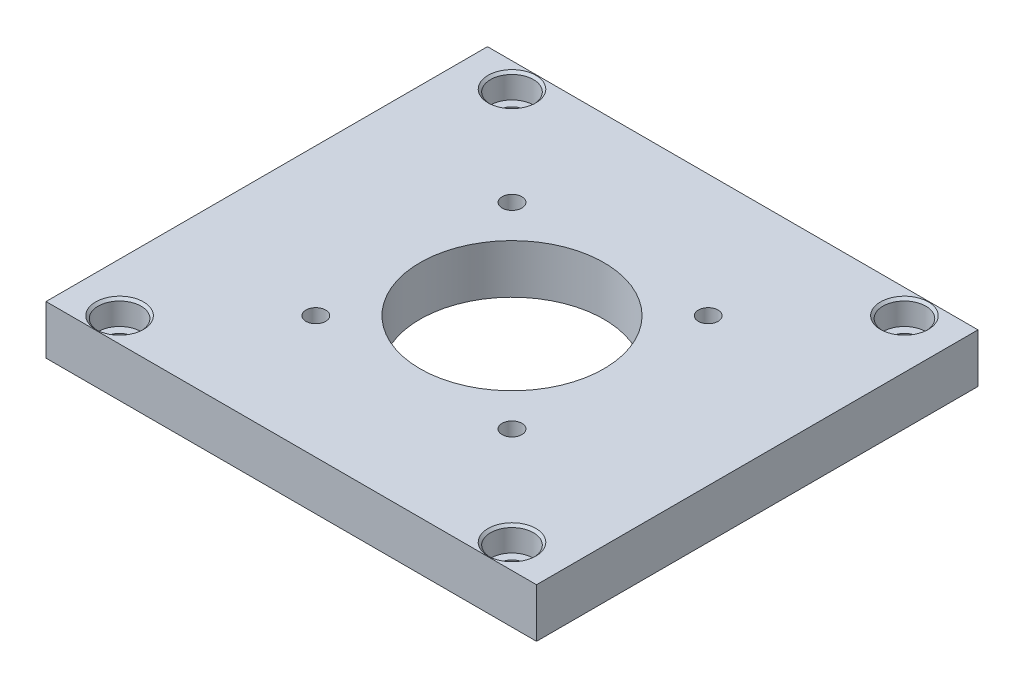
ISO-10303-21;
HEADER;
FILE_DESCRIPTION(('STEP AP214'),'2;1');
FILE_NAME('part.step','',(''),(''),'','','');
FILE_SCHEMA(('AUTOMOTIVE_DESIGN { 1 0 10303 214 1 1 1 1 }'));
ENDSEC;
DATA;
#1=APPLICATION_CONTEXT('core data for automotive mechanical design processes');
#2=APPLICATION_PROTOCOL_DEFINITION('international standard','automotive_design',2000,#1);
#3=PRODUCT_CONTEXT('',#1,'mechanical');
#4=PRODUCT('Part','Part','',(#3));
#5=PRODUCT_RELATED_PRODUCT_CATEGORY('part','',(#4));
#6=PRODUCT_DEFINITION_FORMATION('','',#4);
#7=PRODUCT_DEFINITION_CONTEXT('part definition',#1,'design');
#8=PRODUCT_DEFINITION('design','',#6,#7);
#9=PRODUCT_DEFINITION_SHAPE('','',#8);
#10=(LENGTH_UNIT() NAMED_UNIT(*) SI_UNIT(.MILLI.,.METRE.));
#11=(NAMED_UNIT(*) PLANE_ANGLE_UNIT() SI_UNIT($,.RADIAN.));
#12=(NAMED_UNIT(*) SI_UNIT($,.STERADIAN.) SOLID_ANGLE_UNIT());
#13=UNCERTAINTY_MEASURE_WITH_UNIT(LENGTH_MEASURE(1.E-05),#10,'distance_accuracy_value','');
#14=(GEOMETRIC_REPRESENTATION_CONTEXT(3) GLOBAL_UNCERTAINTY_ASSIGNED_CONTEXT((#13)) GLOBAL_UNIT_ASSIGNED_CONTEXT((#10,
#11,#12)) REPRESENTATION_CONTEXT('',''));
#15=CARTESIAN_POINT('',(0.,0.,0.));
#16=DIRECTION('',(0.,0.,1.));
#17=DIRECTION('',(1.,0.,0.));
#18=AXIS2_PLACEMENT_3D('',#15,#16,#17);
#19=CARTESIAN_POINT('',(-63.5,12.7,57.15));
#20=DIRECTION('',(1.,0.,0.));
#21=DIRECTION('',(0.,0.,-1.));
#22=AXIS2_PLACEMENT_3D('',#19,#20,#21);
#23=PLANE('',#22);
#24=DIRECTION('',(0.,0.,1.));
#25=VECTOR('',#24,1.);
#26=CARTESIAN_POINT('',(-63.5,0.,57.15));
#27=LINE('',#26,#25);
#28=CARTESIAN_POINT('',(-63.5,0.,-57.15));
#29=VERTEX_POINT('',#28);
#30=CARTESIAN_POINT('',(-63.5,0.,57.15));
#31=VERTEX_POINT('',#30);
#32=EDGE_CURVE('E106',#29,#31,#27,.T.);
#33=ORIENTED_EDGE('',*,*,#32,.T.);
#34=DIRECTION('',(0.,-1.,0.));
#35=VECTOR('',#34,1.);
#36=CARTESIAN_POINT('',(-63.5,12.7,57.15));
#37=LINE('',#36,#35);
#38=CARTESIAN_POINT('',(-63.5,12.7,57.15));
#39=VERTEX_POINT('',#38);
#40=EDGE_CURVE('E11',#39,#31,#37,.T.);
#41=ORIENTED_EDGE('',*,*,#40,.F.);
#42=DIRECTION('',(0.,0.,1.));
#43=VECTOR('',#42,1.);
#44=CARTESIAN_POINT('',(-63.5,12.7,57.15));
#45=LINE('',#44,#43);
#46=CARTESIAN_POINT('',(-63.5,12.7,-57.15));
#47=VERTEX_POINT('',#46);
#48=EDGE_CURVE('E93',#47,#39,#45,.T.);
#49=ORIENTED_EDGE('',*,*,#48,.F.);
#50=DIRECTION('',(0.,-1.,0.));
#51=VECTOR('',#50,1.);
#52=CARTESIAN_POINT('',(-63.5,12.7,-57.15));
#53=LINE('',#52,#51);
#54=EDGE_CURVE('E102',#47,#29,#53,.T.);
#55=ORIENTED_EDGE('',*,*,#54,.T.);
#56=EDGE_LOOP('',(#33,#41,#49,#55));
#57=FACE_BOUND('',#56,.T.);
#58=ADVANCED_FACE('F40',(#57),#23,.F.);
#59=CARTESIAN_POINT('',(63.5,12.7,57.15));
#60=DIRECTION('',(0.,0.,-1.));
#61=DIRECTION('',(-1.,0.,0.));
#62=AXIS2_PLACEMENT_3D('',#59,#60,#61);
#63=PLANE('',#62);
#64=DIRECTION('',(1.,0.,0.));
#65=VECTOR('',#64,1.);
#66=CARTESIAN_POINT('',(63.5,0.,57.15));
#67=LINE('',#66,#65);
#68=CARTESIAN_POINT('',(63.5,0.,57.15));
#69=VERTEX_POINT('',#68);
#70=EDGE_CURVE('E97',#31,#69,#67,.T.);
#71=ORIENTED_EDGE('',*,*,#70,.T.);
#72=DIRECTION('',(0.,-1.,0.));
#73=VECTOR('',#72,1.);
#74=CARTESIAN_POINT('',(63.5,12.7,57.15));
#75=LINE('',#74,#73);
#76=CARTESIAN_POINT('',(63.5,12.7,57.15));
#77=VERTEX_POINT('',#76);
#78=EDGE_CURVE('E49',#77,#69,#75,.T.);
#79=ORIENTED_EDGE('',*,*,#78,.F.);
#80=DIRECTION('',(1.,0.,0.));
#81=VECTOR('',#80,1.);
#82=CARTESIAN_POINT('',(63.5,12.7,57.15));
#83=LINE('',#82,#81);
#84=EDGE_CURVE('E88',#39,#77,#83,.T.);
#85=ORIENTED_EDGE('',*,*,#84,.F.);
#86=ORIENTED_EDGE('',*,*,#40,.T.);
#87=EDGE_LOOP('',(#71,#79,#85,#86));
#88=FACE_BOUND('',#87,.T.);
#89=ADVANCED_FACE('F96',(#88),#63,.F.);
#90=CARTESIAN_POINT('',(63.5,12.7,57.15));
#91=DIRECTION('',(-1.,0.,0.));
#92=DIRECTION('',(0.,0.,1.));
#93=AXIS2_PLACEMENT_3D('',#90,#91,#92);
#94=PLANE('',#93);
#95=DIRECTION('',(0.,0.,-1.));
#96=VECTOR('',#95,1.);
#97=CARTESIAN_POINT('',(63.5,0.,57.15));
#98=LINE('',#97,#96);
#99=CARTESIAN_POINT('',(63.5,0.,-57.15));
#100=VERTEX_POINT('',#99);
#101=EDGE_CURVE('E75',#69,#100,#98,.T.);
#102=ORIENTED_EDGE('',*,*,#101,.T.);
#103=DIRECTION('',(0.,-1.,0.));
#104=VECTOR('',#103,1.);
#105=CARTESIAN_POINT('',(63.5,12.7,-57.15));
#106=LINE('',#105,#104);
#107=CARTESIAN_POINT('',(63.5,12.7,-57.15));
#108=VERTEX_POINT('',#107);
#109=EDGE_CURVE('E98',#108,#100,#106,.T.);
#110=ORIENTED_EDGE('',*,*,#109,.F.);
#111=DIRECTION('',(0.,0.,-1.));
#112=VECTOR('',#111,1.);
#113=CARTESIAN_POINT('',(63.5,12.7,57.15));
#114=LINE('',#113,#112);
#115=EDGE_CURVE('E91',#77,#108,#114,.T.);
#116=ORIENTED_EDGE('',*,*,#115,.F.);
#117=ORIENTED_EDGE('',*,*,#78,.T.);
#118=EDGE_LOOP('',(#102,#110,#116,#117));
#119=FACE_BOUND('',#118,.T.);
#120=ADVANCED_FACE('F100',(#119),#94,.F.);
#121=CARTESIAN_POINT('',(63.5,12.7,-57.15));
#122=DIRECTION('',(0.,0.,1.));
#123=DIRECTION('',(1.,0.,0.));
#124=AXIS2_PLACEMENT_3D('',#121,#122,#123);
#125=PLANE('',#124);
#126=DIRECTION('',(-1.,0.,0.));
#127=VECTOR('',#126,1.);
#128=CARTESIAN_POINT('',(63.5,0.,-57.15));
#129=LINE('',#128,#127);
#130=EDGE_CURVE('E81',#100,#29,#129,.T.);
#131=ORIENTED_EDGE('',*,*,#130,.T.);
#132=ORIENTED_EDGE('',*,*,#54,.F.);
#133=DIRECTION('',(-1.,0.,0.));
#134=VECTOR('',#133,1.);
#135=CARTESIAN_POINT('',(63.5,12.7,-57.15));
#136=LINE('',#135,#134);
#137=EDGE_CURVE('E58',#108,#47,#136,.T.);
#138=ORIENTED_EDGE('',*,*,#137,.F.);
#139=ORIENTED_EDGE('',*,*,#109,.T.);
#140=EDGE_LOOP('',(#131,#132,#138,#139));
#141=FACE_BOUND('',#140,.T.);
#142=ADVANCED_FACE('F214',(#141),#125,.F.);
#143=CARTESIAN_POINT('',(0.,12.7,0.));
#144=DIRECTION('',(0.,1.,0.));
#145=DIRECTION('',(0.,0.,1.));
#146=AXIS2_PLACEMENT_3D('',#143,#144,#145);
#147=PLANE('',#146);
#148=CARTESIAN_POINT('',(-25.4,12.7,-25.4));
#149=DIRECTION('',(0.,1.,0.));
#150=DIRECTION('',(0.,0.,1.));
#151=AXIS2_PLACEMENT_3D('',#148,#149,#150);
#152=CIRCLE('',#151,2.55269999999999);
#153=CARTESIAN_POINT('',(-25.4,12.7,-22.8473));
#154=VERTEX_POINT('',#153);
#155=EDGE_CURVE('E139',#154,#154,#152,.T.);
#156=ORIENTED_EDGE('',*,*,#155,.F.);
#157=EDGE_LOOP('',(#156));
#158=FACE_BOUND('',#157,.T.);
#159=CARTESIAN_POINT('',(25.4,12.7,-25.4));
#160=DIRECTION('',(0.,1.,0.));
#161=DIRECTION('',(0.,0.,1.));
#162=AXIS2_PLACEMENT_3D('',#159,#160,#161);
#163=CIRCLE('',#162,2.55269999999999);
#164=CARTESIAN_POINT('',(25.4,12.7,-22.8473));
#165=VERTEX_POINT('',#164);
#166=EDGE_CURVE('E128',#165,#165,#163,.T.);
#167=ORIENTED_EDGE('',*,*,#166,.F.);
#168=EDGE_LOOP('',(#167));
#169=FACE_BOUND('',#168,.T.);
#170=CARTESIAN_POINT('',(25.4,12.7,25.4));
#171=DIRECTION('',(0.,1.,0.));
#172=DIRECTION('',(0.,0.,1.));
#173=AXIS2_PLACEMENT_3D('',#170,#171,#172);
#174=CIRCLE('',#173,2.55269999999999);
#175=CARTESIAN_POINT('',(25.4,12.7,27.9527));
#176=VERTEX_POINT('',#175);
#177=EDGE_CURVE('E124',#176,#176,#174,.T.);
#178=ORIENTED_EDGE('',*,*,#177,.F.);
#179=EDGE_LOOP('',(#178));
#180=FACE_BOUND('',#179,.T.);
#181=CARTESIAN_POINT('',(-25.4,12.7,25.4));
#182=DIRECTION('',(0.,1.,0.));
#183=DIRECTION('',(0.,0.,1.));
#184=AXIS2_PLACEMENT_3D('',#181,#182,#183);
#185=CIRCLE('',#184,2.55269999999999);
#186=CARTESIAN_POINT('',(-25.4,12.7,27.9527));
#187=VERTEX_POINT('',#186);
#188=EDGE_CURVE('E120',#187,#187,#185,.T.);
#189=ORIENTED_EDGE('',*,*,#188,.F.);
#190=EDGE_LOOP('',(#189));
#191=FACE_BOUND('',#190,.T.);
#192=CARTESIAN_POINT('',(-50.8,12.7,-50.8));
#193=DIRECTION('',(0.,1.,0.));
#194=DIRECTION('',(0.,0.,1.));
#195=AXIS2_PLACEMENT_3D('',#192,#193,#194);
#196=CIRCLE('',#195,6.19125);
#197=CARTESIAN_POINT('',(-50.8,12.7,-44.60875));
#198=VERTEX_POINT('',#197);
#199=EDGE_CURVE('E119',#198,#198,#196,.T.);
#200=ORIENTED_EDGE('',*,*,#199,.F.);
#201=EDGE_LOOP('',(#200));
#202=FACE_BOUND('',#201,.T.);
#203=CARTESIAN_POINT('',(50.8,12.7,-50.8));
#204=DIRECTION('',(0.,1.,0.));
#205=DIRECTION('',(0.,0.,1.));
#206=AXIS2_PLACEMENT_3D('',#203,#204,#205);
#207=CIRCLE('',#206,6.19125);
#208=CARTESIAN_POINT('',(50.8,12.7,-44.60875));
#209=VERTEX_POINT('',#208);
#210=EDGE_CURVE('E158',#209,#209,#207,.T.);
#211=ORIENTED_EDGE('',*,*,#210,.F.);
#212=EDGE_LOOP('',(#211));
#213=FACE_BOUND('',#212,.T.);
#214=CARTESIAN_POINT('',(50.8,12.7,50.8));
#215=DIRECTION('',(0.,1.,0.));
#216=DIRECTION('',(0.,0.,1.));
#217=AXIS2_PLACEMENT_3D('',#214,#215,#216);
#218=CIRCLE('',#217,6.19125);
#219=CARTESIAN_POINT('',(50.8,12.7,56.99125));
#220=VERTEX_POINT('',#219);
#221=EDGE_CURVE('E173',#220,#220,#218,.T.);
#222=ORIENTED_EDGE('',*,*,#221,.F.);
#223=EDGE_LOOP('',(#222));
#224=FACE_BOUND('',#223,.T.);
#225=CARTESIAN_POINT('',(-50.8,12.7,50.8));
#226=DIRECTION('',(0.,1.,0.));
#227=DIRECTION('',(0.,0.,1.));
#228=AXIS2_PLACEMENT_3D('',#225,#226,#227);
#229=CIRCLE('',#228,6.19125);
#230=CARTESIAN_POINT('',(-50.8,12.7,56.99125));
#231=VERTEX_POINT('',#230);
#232=EDGE_CURVE('E188',#231,#231,#229,.T.);
#233=ORIENTED_EDGE('',*,*,#232,.F.);
#234=EDGE_LOOP('',(#233));
#235=FACE_BOUND('',#234,.T.);
#236=CARTESIAN_POINT('',(0.,12.7,0.));
#237=DIRECTION('',(0.,1.,0.));
#238=DIRECTION('',(0.,0.,1.));
#239=AXIS2_PLACEMENT_3D('',#236,#237,#238);
#240=CIRCLE('',#239,23.8125);
#241=CARTESIAN_POINT('',(0.,12.7,23.8125));
#242=VERTEX_POINT('',#241);
#243=EDGE_CURVE('E203',#242,#242,#240,.T.);
#244=ORIENTED_EDGE('',*,*,#243,.F.);
#245=EDGE_LOOP('',(#244));
#246=FACE_BOUND('',#245,.T.);
#247=ORIENTED_EDGE('',*,*,#48,.T.);
#248=ORIENTED_EDGE('',*,*,#84,.T.);
#249=ORIENTED_EDGE('',*,*,#115,.T.);
#250=ORIENTED_EDGE('',*,*,#137,.T.);
#251=EDGE_LOOP('',(#247,#248,#249,#250));
#252=FACE_BOUND('',#251,.T.);
#253=ADVANCED_FACE('F89',(#158,#169,#180,#191,#202,#213,#224,#235,#246,#252),#147,.T.);
#254=CARTESIAN_POINT('',(0.,0.,0.));
#255=DIRECTION('',(0.,1.,0.));
#256=DIRECTION('',(0.,0.,1.));
#257=AXIS2_PLACEMENT_3D('',#254,#255,#256);
#258=PLANE('',#257);
#259=CARTESIAN_POINT('',(-25.4,0.,-25.4));
#260=DIRECTION('',(0.,1.,0.));
#261=DIRECTION('',(0.,0.,1.));
#262=AXIS2_PLACEMENT_3D('',#259,#260,#261);
#263=CIRCLE('',#262,2.55269999999999);
#264=CARTESIAN_POINT('',(-25.4,0.,-22.8473));
#265=VERTEX_POINT('',#264);
#266=EDGE_CURVE('E43',#265,#265,#263,.T.);
#267=ORIENTED_EDGE('',*,*,#266,.T.);
#268=EDGE_LOOP('',(#267));
#269=FACE_BOUND('',#268,.T.);
#270=CARTESIAN_POINT('',(25.4,0.,-25.4));
#271=DIRECTION('',(0.,1.,0.));
#272=DIRECTION('',(0.,0.,1.));
#273=AXIS2_PLACEMENT_3D('',#270,#271,#272);
#274=CIRCLE('',#273,2.55269999999999);
#275=CARTESIAN_POINT('',(25.4,0.,-22.8473));
#276=VERTEX_POINT('',#275);
#277=EDGE_CURVE('E125',#276,#276,#274,.T.);
#278=ORIENTED_EDGE('',*,*,#277,.T.);
#279=EDGE_LOOP('',(#278));
#280=FACE_BOUND('',#279,.T.);
#281=CARTESIAN_POINT('',(25.4,0.,25.4));
#282=DIRECTION('',(0.,1.,0.));
#283=DIRECTION('',(0.,0.,1.));
#284=AXIS2_PLACEMENT_3D('',#281,#282,#283);
#285=CIRCLE('',#284,2.55269999999999);
#286=CARTESIAN_POINT('',(25.4,0.,27.9527));
#287=VERTEX_POINT('',#286);
#288=EDGE_CURVE('E121',#287,#287,#285,.T.);
#289=ORIENTED_EDGE('',*,*,#288,.T.);
#290=EDGE_LOOP('',(#289));
#291=FACE_BOUND('',#290,.T.);
#292=CARTESIAN_POINT('',(-25.4,0.,25.4));
#293=DIRECTION('',(0.,1.,0.));
#294=DIRECTION('',(0.,0.,1.));
#295=AXIS2_PLACEMENT_3D('',#292,#293,#294);
#296=CIRCLE('',#295,2.55269999999999);
#297=CARTESIAN_POINT('',(-25.4,0.,27.9527));
#298=VERTEX_POINT('',#297);
#299=EDGE_CURVE('E115',#298,#298,#296,.T.);
#300=ORIENTED_EDGE('',*,*,#299,.T.);
#301=EDGE_LOOP('',(#300));
#302=FACE_BOUND('',#301,.T.);
#303=CARTESIAN_POINT('',(-50.8,0.,-50.8));
#304=DIRECTION('',(0.,1.,0.));
#305=DIRECTION('',(0.,0.,1.));
#306=AXIS2_PLACEMENT_3D('',#303,#304,#305);
#307=CIRCLE('',#306,3.37820000000001);
#308=CARTESIAN_POINT('',(-50.8,0.,-47.4218));
#309=VERTEX_POINT('',#308);
#310=EDGE_CURVE('E155',#309,#309,#307,.T.);
#311=ORIENTED_EDGE('',*,*,#310,.T.);
#312=EDGE_LOOP('',(#311));
#313=FACE_BOUND('',#312,.T.);
#314=CARTESIAN_POINT('',(50.8,0.,-50.8));
#315=DIRECTION('',(0.,1.,0.));
#316=DIRECTION('',(0.,0.,1.));
#317=AXIS2_PLACEMENT_3D('',#314,#315,#316);
#318=CIRCLE('',#317,3.37820000000001);
#319=CARTESIAN_POINT('',(50.8,0.,-47.4218));
#320=VERTEX_POINT('',#319);
#321=EDGE_CURVE('E170',#320,#320,#318,.T.);
#322=ORIENTED_EDGE('',*,*,#321,.T.);
#323=EDGE_LOOP('',(#322));
#324=FACE_BOUND('',#323,.T.);
#325=CARTESIAN_POINT('',(50.8,0.,50.8));
#326=DIRECTION('',(0.,1.,0.));
#327=DIRECTION('',(0.,0.,1.));
#328=AXIS2_PLACEMENT_3D('',#325,#326,#327);
#329=CIRCLE('',#328,3.37820000000001);
#330=CARTESIAN_POINT('',(50.8,0.,54.1782));
#331=VERTEX_POINT('',#330);
#332=EDGE_CURVE('E185',#331,#331,#329,.T.);
#333=ORIENTED_EDGE('',*,*,#332,.T.);
#334=EDGE_LOOP('',(#333));
#335=FACE_BOUND('',#334,.T.);
#336=CARTESIAN_POINT('',(-50.8,0.,50.8));
#337=DIRECTION('',(0.,1.,0.));
#338=DIRECTION('',(0.,0.,1.));
#339=AXIS2_PLACEMENT_3D('',#336,#337,#338);
#340=CIRCLE('',#339,3.37820000000001);
#341=CARTESIAN_POINT('',(-50.8,0.,54.1782));
#342=VERTEX_POINT('',#341);
#343=EDGE_CURVE('E200',#342,#342,#340,.T.);
#344=ORIENTED_EDGE('',*,*,#343,.T.);
#345=EDGE_LOOP('',(#344));
#346=FACE_BOUND('',#345,.T.);
#347=CARTESIAN_POINT('',(0.,0.,0.));
#348=DIRECTION('',(0.,1.,0.));
#349=DIRECTION('',(0.,0.,1.));
#350=AXIS2_PLACEMENT_3D('',#347,#348,#349);
#351=CIRCLE('',#350,23.8125);
#352=CARTESIAN_POINT('',(0.,0.,23.8125));
#353=VERTEX_POINT('',#352);
#354=EDGE_CURVE('E109',#353,#353,#351,.T.);
#355=ORIENTED_EDGE('',*,*,#354,.T.);
#356=EDGE_LOOP('',(#355));
#357=FACE_BOUND('',#356,.T.);
#358=ORIENTED_EDGE('',*,*,#32,.F.);
#359=ORIENTED_EDGE('',*,*,#130,.F.);
#360=ORIENTED_EDGE('',*,*,#101,.F.);
#361=ORIENTED_EDGE('',*,*,#70,.F.);
#362=EDGE_LOOP('',(#358,#359,#360,#361));
#363=FACE_BOUND('',#362,.T.);
#364=ADVANCED_FACE('F213',(#269,#280,#291,#302,#313,#324,#335,#346,#357,#363),#258,.F.);
#365=CARTESIAN_POINT('',(0.,0.,0.));
#366=DIRECTION('',(0.,1.,0.));
#367=DIRECTION('',(0.,0.,1.));
#368=AXIS2_PLACEMENT_3D('',#365,#366,#367);
#369=CYLINDRICAL_SURFACE('',#368,23.8125);
#370=ORIENTED_EDGE('',*,*,#354,.F.);
#371=EDGE_LOOP('',(#370));
#372=FACE_BOUND('',#371,.T.);
#373=ORIENTED_EDGE('',*,*,#243,.T.);
#374=EDGE_LOOP('',(#373));
#375=FACE_BOUND('',#374,.T.);
#376=ADVANCED_FACE('F210',(#372,#375),#369,.F.);
#377=CARTESIAN_POINT('',(-50.8,12.7,50.8));
#378=DIRECTION('',(0.,1.,0.));
#379=DIRECTION('',(0.,0.,1.));
#380=AXIS2_PLACEMENT_3D('',#377,#378,#379);
#381=CYLINDRICAL_SURFACE('',#380,3.37820000000001);
#382=ORIENTED_EDGE('',*,*,#343,.F.);
#383=EDGE_LOOP('',(#382));
#384=FACE_BOUND('',#383,.T.);
#385=CARTESIAN_POINT('',(-50.8,6.35,50.8));
#386=DIRECTION('',(0.,1.,0.));
#387=DIRECTION('',(0.,0.,1.));
#388=AXIS2_PLACEMENT_3D('',#385,#386,#387);
#389=CIRCLE('',#388,3.37820000000001);
#390=CARTESIAN_POINT('',(-50.8,6.35,54.1782));
#391=VERTEX_POINT('',#390);
#392=EDGE_CURVE('E197',#391,#391,#389,.T.);
#393=ORIENTED_EDGE('',*,*,#392,.T.);
#394=EDGE_LOOP('',(#393));
#395=FACE_BOUND('',#394,.T.);
#396=ADVANCED_FACE('F255',(#384,#395),#381,.F.);
#397=CARTESIAN_POINT('',(-45.24375,6.35,50.8));
#398=DIRECTION('',(0.,-1.,0.));
#399=DIRECTION('',(0.,0.,-1.));
#400=AXIS2_PLACEMENT_3D('',#397,#398,#399);
#401=PLANE('',#400);
#402=ORIENTED_EDGE('',*,*,#392,.F.);
#403=EDGE_LOOP('',(#402));
#404=FACE_BOUND('',#403,.T.);
#405=CARTESIAN_POINT('',(-50.8,6.35,50.8));
#406=DIRECTION('',(0.,1.,0.));
#407=DIRECTION('',(0.,0.,1.));
#408=AXIS2_PLACEMENT_3D('',#405,#406,#407);
#409=CIRCLE('',#408,5.55625);
#410=CARTESIAN_POINT('',(-50.8,6.35,56.35625));
#411=VERTEX_POINT('',#410);
#412=EDGE_CURVE('E194',#411,#411,#409,.T.);
#413=ORIENTED_EDGE('',*,*,#412,.T.);
#414=EDGE_LOOP('',(#413));
#415=FACE_BOUND('',#414,.T.);
#416=ADVANCED_FACE('F266',(#404,#415),#401,.F.);
#417=CARTESIAN_POINT('',(-50.8,12.7,50.8));
#418=DIRECTION('',(0.,1.,0.));
#419=DIRECTION('',(0.,0.,1.));
#420=AXIS2_PLACEMENT_3D('',#417,#418,#419);
#421=CYLINDRICAL_SURFACE('',#420,5.55625);
#422=ORIENTED_EDGE('',*,*,#412,.F.);
#423=EDGE_LOOP('',(#422));
#424=FACE_BOUND('',#423,.T.);
#425=CARTESIAN_POINT('',(-50.8,12.065,50.8));
#426=DIRECTION('',(0.,1.,0.));
#427=DIRECTION('',(0.,0.,1.));
#428=AXIS2_PLACEMENT_3D('',#425,#426,#427);
#429=CIRCLE('',#428,5.55625);
#430=CARTESIAN_POINT('',(-50.8,12.065,56.35625));
#431=VERTEX_POINT('',#430);
#432=EDGE_CURVE('E191',#431,#431,#429,.T.);
#433=ORIENTED_EDGE('',*,*,#432,.T.);
#434=EDGE_LOOP('',(#433));
#435=FACE_BOUND('',#434,.T.);
#436=ADVANCED_FACE('F277',(#424,#435),#421,.F.);
#437=CARTESIAN_POINT('',(-50.8,12.7,50.8));
#438=DIRECTION('',(0.,1.,0.));
#439=DIRECTION('',(0.,0.,1.));
#440=AXIS2_PLACEMENT_3D('',#437,#438,#439);
#441=CONICAL_SURFACE('',#440,6.19125,0.78539816339744);
#442=ORIENTED_EDGE('',*,*,#432,.F.);
#443=EDGE_LOOP('',(#442));
#444=FACE_BOUND('',#443,.T.);
#445=ORIENTED_EDGE('',*,*,#232,.T.);
#446=EDGE_LOOP('',(#445));
#447=FACE_BOUND('',#446,.T.);
#448=ADVANCED_FACE('F288',(#444,#447),#441,.F.);
#449=CARTESIAN_POINT('',(50.8,12.7,50.8));
#450=DIRECTION('',(0.,1.,0.));
#451=DIRECTION('',(0.,0.,1.));
#452=AXIS2_PLACEMENT_3D('',#449,#450,#451);
#453=CYLINDRICAL_SURFACE('',#452,3.37820000000001);
#454=ORIENTED_EDGE('',*,*,#332,.F.);
#455=EDGE_LOOP('',(#454));
#456=FACE_BOUND('',#455,.T.);
#457=CARTESIAN_POINT('',(50.8,6.35,50.8));
#458=DIRECTION('',(0.,1.,0.));
#459=DIRECTION('',(0.,0.,1.));
#460=AXIS2_PLACEMENT_3D('',#457,#458,#459);
#461=CIRCLE('',#460,3.37820000000001);
#462=CARTESIAN_POINT('',(50.8,6.35,54.1782));
#463=VERTEX_POINT('',#462);
#464=EDGE_CURVE('E182',#463,#463,#461,.T.);
#465=ORIENTED_EDGE('',*,*,#464,.T.);
#466=EDGE_LOOP('',(#465));
#467=FACE_BOUND('',#466,.T.);
#468=ADVANCED_FACE('F301',(#456,#467),#453,.F.);
#469=CARTESIAN_POINT('',(56.35625,6.35,50.8));
#470=DIRECTION('',(0.,-1.,0.));
#471=DIRECTION('',(0.,0.,-1.));
#472=AXIS2_PLACEMENT_3D('',#469,#470,#471);
#473=PLANE('',#472);
#474=ORIENTED_EDGE('',*,*,#464,.F.);
#475=EDGE_LOOP('',(#474));
#476=FACE_BOUND('',#475,.T.);
#477=CARTESIAN_POINT('',(50.8,6.35,50.8));
#478=DIRECTION('',(0.,1.,0.));
#479=DIRECTION('',(0.,0.,1.));
#480=AXIS2_PLACEMENT_3D('',#477,#478,#479);
#481=CIRCLE('',#480,5.55625);
#482=CARTESIAN_POINT('',(50.8,6.35,56.35625));
#483=VERTEX_POINT('',#482);
#484=EDGE_CURVE('E179',#483,#483,#481,.T.);
#485=ORIENTED_EDGE('',*,*,#484,.T.);
#486=EDGE_LOOP('',(#485));
#487=FACE_BOUND('',#486,.T.);
#488=ADVANCED_FACE('F311',(#476,#487),#473,.F.);
#489=CARTESIAN_POINT('',(50.8,12.7,50.8));
#490=DIRECTION('',(0.,1.,0.));
#491=DIRECTION('',(0.,0.,1.));
#492=AXIS2_PLACEMENT_3D('',#489,#490,#491);
#493=CYLINDRICAL_SURFACE('',#492,5.55625);
#494=ORIENTED_EDGE('',*,*,#484,.F.);
#495=EDGE_LOOP('',(#494));
#496=FACE_BOUND('',#495,.T.);
#497=CARTESIAN_POINT('',(50.8,12.065,50.8));
#498=DIRECTION('',(0.,1.,0.));
#499=DIRECTION('',(0.,0.,1.));
#500=AXIS2_PLACEMENT_3D('',#497,#498,#499);
#501=CIRCLE('',#500,5.55625);
#502=CARTESIAN_POINT('',(50.8,12.065,56.35625));
#503=VERTEX_POINT('',#502);
#504=EDGE_CURVE('E176',#503,#503,#501,.T.);
#505=ORIENTED_EDGE('',*,*,#504,.T.);
#506=EDGE_LOOP('',(#505));
#507=FACE_BOUND('',#506,.T.);
#508=ADVANCED_FACE('F320',(#496,#507),#493,.F.);
#509=CARTESIAN_POINT('',(50.8,12.7,50.8));
#510=DIRECTION('',(0.,1.,0.));
#511=DIRECTION('',(0.,0.,1.));
#512=AXIS2_PLACEMENT_3D('',#509,#510,#511);
#513=CONICAL_SURFACE('',#512,6.19125,0.78539816339744);
#514=ORIENTED_EDGE('',*,*,#504,.F.);
#515=EDGE_LOOP('',(#514));
#516=FACE_BOUND('',#515,.T.);
#517=ORIENTED_EDGE('',*,*,#221,.T.);
#518=EDGE_LOOP('',(#517));
#519=FACE_BOUND('',#518,.T.);
#520=ADVANCED_FACE('F330',(#516,#519),#513,.F.);
#521=CARTESIAN_POINT('',(50.8,12.7,-50.8));
#522=DIRECTION('',(0.,1.,0.));
#523=DIRECTION('',(0.,0.,1.));
#524=AXIS2_PLACEMENT_3D('',#521,#522,#523);
#525=CYLINDRICAL_SURFACE('',#524,3.37820000000001);
#526=ORIENTED_EDGE('',*,*,#321,.F.);
#527=EDGE_LOOP('',(#526));
#528=FACE_BOUND('',#527,.T.);
#529=CARTESIAN_POINT('',(50.8,6.35,-50.8));
#530=DIRECTION('',(0.,1.,0.));
#531=DIRECTION('',(0.,0.,1.));
#532=AXIS2_PLACEMENT_3D('',#529,#530,#531);
#533=CIRCLE('',#532,3.37820000000001);
#534=CARTESIAN_POINT('',(50.8,6.35,-47.4218));
#535=VERTEX_POINT('',#534);
#536=EDGE_CURVE('E167',#535,#535,#533,.T.);
#537=ORIENTED_EDGE('',*,*,#536,.T.);
#538=EDGE_LOOP('',(#537));
#539=FACE_BOUND('',#538,.T.);
#540=ADVANCED_FACE('F342',(#528,#539),#525,.F.);
#541=CARTESIAN_POINT('',(56.35625,6.35,-50.8));
#542=DIRECTION('',(0.,-1.,0.));
#543=DIRECTION('',(0.,0.,-1.));
#544=AXIS2_PLACEMENT_3D('',#541,#542,#543);
#545=PLANE('',#544);
#546=ORIENTED_EDGE('',*,*,#536,.F.);
#547=EDGE_LOOP('',(#546));
#548=FACE_BOUND('',#547,.T.);
#549=CARTESIAN_POINT('',(50.8,6.35,-50.8));
#550=DIRECTION('',(0.,1.,0.));
#551=DIRECTION('',(0.,0.,1.));
#552=AXIS2_PLACEMENT_3D('',#549,#550,#551);
#553=CIRCLE('',#552,5.55625);
#554=CARTESIAN_POINT('',(50.8,6.35,-45.24375));
#555=VERTEX_POINT('',#554);
#556=EDGE_CURVE('E164',#555,#555,#553,.T.);
#557=ORIENTED_EDGE('',*,*,#556,.T.);
#558=EDGE_LOOP('',(#557));
#559=FACE_BOUND('',#558,.T.);
#560=ADVANCED_FACE('F352',(#548,#559),#545,.F.);
#561=CARTESIAN_POINT('',(50.8,12.7,-50.8));
#562=DIRECTION('',(0.,1.,0.));
#563=DIRECTION('',(0.,0.,1.));
#564=AXIS2_PLACEMENT_3D('',#561,#562,#563);
#565=CYLINDRICAL_SURFACE('',#564,5.55625);
#566=ORIENTED_EDGE('',*,*,#556,.F.);
#567=EDGE_LOOP('',(#566));
#568=FACE_BOUND('',#567,.T.);
#569=CARTESIAN_POINT('',(50.8,12.065,-50.8));
#570=DIRECTION('',(0.,1.,0.));
#571=DIRECTION('',(0.,0.,1.));
#572=AXIS2_PLACEMENT_3D('',#569,#570,#571);
#573=CIRCLE('',#572,5.55625);
#574=CARTESIAN_POINT('',(50.8,12.065,-45.24375));
#575=VERTEX_POINT('',#574);
#576=EDGE_CURVE('E161',#575,#575,#573,.T.);
#577=ORIENTED_EDGE('',*,*,#576,.T.);
#578=EDGE_LOOP('',(#577));
#579=FACE_BOUND('',#578,.T.);
#580=ADVANCED_FACE('F362',(#568,#579),#565,.F.);
#581=CARTESIAN_POINT('',(50.8,12.7,-50.8));
#582=DIRECTION('',(0.,1.,0.));
#583=DIRECTION('',(0.,0.,1.));
#584=AXIS2_PLACEMENT_3D('',#581,#582,#583);
#585=CONICAL_SURFACE('',#584,6.19125,0.78539816339744);
#586=ORIENTED_EDGE('',*,*,#576,.F.);
#587=EDGE_LOOP('',(#586));
#588=FACE_BOUND('',#587,.T.);
#589=ORIENTED_EDGE('',*,*,#210,.T.);
#590=EDGE_LOOP('',(#589));
#591=FACE_BOUND('',#590,.T.);
#592=ADVANCED_FACE('F372',(#588,#591),#585,.F.);
#593=CARTESIAN_POINT('',(-50.8,12.7,-50.8));
#594=DIRECTION('',(0.,1.,0.));
#595=DIRECTION('',(0.,0.,1.));
#596=AXIS2_PLACEMENT_3D('',#593,#594,#595);
#597=CYLINDRICAL_SURFACE('',#596,3.37820000000001);
#598=ORIENTED_EDGE('',*,*,#310,.F.);
#599=EDGE_LOOP('',(#598));
#600=FACE_BOUND('',#599,.T.);
#601=CARTESIAN_POINT('',(-50.8,6.35,-50.8));
#602=DIRECTION('',(0.,1.,0.));
#603=DIRECTION('',(0.,0.,1.));
#604=AXIS2_PLACEMENT_3D('',#601,#602,#603);
#605=CIRCLE('',#604,3.37820000000001);
#606=CARTESIAN_POINT('',(-50.8,6.35,-47.4218));
#607=VERTEX_POINT('',#606);
#608=EDGE_CURVE('E152',#607,#607,#605,.T.);
#609=ORIENTED_EDGE('',*,*,#608,.T.);
#610=EDGE_LOOP('',(#609));
#611=FACE_BOUND('',#610,.T.);
#612=ADVANCED_FACE('F384',(#600,#611),#597,.F.);
#613=CARTESIAN_POINT('',(-45.24375,6.35,-50.8));
#614=DIRECTION('',(0.,-1.,0.));
#615=DIRECTION('',(0.,0.,-1.));
#616=AXIS2_PLACEMENT_3D('',#613,#614,#615);
#617=PLANE('',#616);
#618=ORIENTED_EDGE('',*,*,#608,.F.);
#619=EDGE_LOOP('',(#618));
#620=FACE_BOUND('',#619,.T.);
#621=CARTESIAN_POINT('',(-50.8,6.35,-50.8));
#622=DIRECTION('',(0.,1.,0.));
#623=DIRECTION('',(0.,0.,1.));
#624=AXIS2_PLACEMENT_3D('',#621,#622,#623);
#625=CIRCLE('',#624,5.55625);
#626=CARTESIAN_POINT('',(-50.8,6.35,-45.24375));
#627=VERTEX_POINT('',#626);
#628=EDGE_CURVE('E149',#627,#627,#625,.T.);
#629=ORIENTED_EDGE('',*,*,#628,.T.);
#630=EDGE_LOOP('',(#629));
#631=FACE_BOUND('',#630,.T.);
#632=ADVANCED_FACE('F394',(#620,#631),#617,.F.);
#633=CARTESIAN_POINT('',(-50.8,12.7,-50.8));
#634=DIRECTION('',(0.,1.,0.));
#635=DIRECTION('',(0.,0.,1.));
#636=AXIS2_PLACEMENT_3D('',#633,#634,#635);
#637=CYLINDRICAL_SURFACE('',#636,5.55625);
#638=ORIENTED_EDGE('',*,*,#628,.F.);
#639=EDGE_LOOP('',(#638));
#640=FACE_BOUND('',#639,.T.);
#641=CARTESIAN_POINT('',(-50.8,12.065,-50.8));
#642=DIRECTION('',(0.,1.,0.));
#643=DIRECTION('',(0.,0.,1.));
#644=AXIS2_PLACEMENT_3D('',#641,#642,#643);
#645=CIRCLE('',#644,5.55625);
#646=CARTESIAN_POINT('',(-50.8,12.065,-45.24375));
#647=VERTEX_POINT('',#646);
#648=EDGE_CURVE('E146',#647,#647,#645,.T.);
#649=ORIENTED_EDGE('',*,*,#648,.T.);
#650=EDGE_LOOP('',(#649));
#651=FACE_BOUND('',#650,.T.);
#652=ADVANCED_FACE('F404',(#640,#651),#637,.F.);
#653=CARTESIAN_POINT('',(-50.8,12.7,-50.8));
#654=DIRECTION('',(0.,1.,0.));
#655=DIRECTION('',(0.,0.,1.));
#656=AXIS2_PLACEMENT_3D('',#653,#654,#655);
#657=CONICAL_SURFACE('',#656,6.19125,0.78539816339744);
#658=ORIENTED_EDGE('',*,*,#648,.F.);
#659=EDGE_LOOP('',(#658));
#660=FACE_BOUND('',#659,.T.);
#661=ORIENTED_EDGE('',*,*,#199,.T.);
#662=EDGE_LOOP('',(#661));
#663=FACE_BOUND('',#662,.T.);
#664=ADVANCED_FACE('F414',(#660,#663),#657,.F.);
#665=CARTESIAN_POINT('',(-25.4,12.7,25.4));
#666=DIRECTION('',(0.,1.,0.));
#667=DIRECTION('',(0.,0.,1.));
#668=AXIS2_PLACEMENT_3D('',#665,#666,#667);
#669=CYLINDRICAL_SURFACE('',#668,2.55269999999999);
#670=ORIENTED_EDGE('',*,*,#188,.T.);
#671=EDGE_LOOP('',(#670));
#672=FACE_BOUND('',#671,.T.);
#673=ORIENTED_EDGE('',*,*,#299,.F.);
#674=EDGE_LOOP('',(#673));
#675=FACE_BOUND('',#674,.T.);
#676=ADVANCED_FACE('F424',(#672,#675),#669,.F.);
#677=CARTESIAN_POINT('',(25.4,12.7,25.4));
#678=DIRECTION('',(0.,1.,0.));
#679=DIRECTION('',(0.,0.,1.));
#680=AXIS2_PLACEMENT_3D('',#677,#678,#679);
#681=CYLINDRICAL_SURFACE('',#680,2.55269999999999);
#682=ORIENTED_EDGE('',*,*,#177,.T.);
#683=EDGE_LOOP('',(#682));
#684=FACE_BOUND('',#683,.T.);
#685=ORIENTED_EDGE('',*,*,#288,.F.);
#686=EDGE_LOOP('',(#685));
#687=FACE_BOUND('',#686,.T.);
#688=ADVANCED_FACE('F444',(#684,#687),#681,.F.);
#689=CARTESIAN_POINT('',(25.4,12.7,-25.4));
#690=DIRECTION('',(0.,1.,0.));
#691=DIRECTION('',(0.,0.,1.));
#692=AXIS2_PLACEMENT_3D('',#689,#690,#691);
#693=CYLINDRICAL_SURFACE('',#692,2.55269999999999);
#694=ORIENTED_EDGE('',*,*,#166,.T.);
#695=EDGE_LOOP('',(#694));
#696=FACE_BOUND('',#695,.T.);
#697=ORIENTED_EDGE('',*,*,#277,.F.);
#698=EDGE_LOOP('',(#697));
#699=FACE_BOUND('',#698,.T.);
#700=ADVANCED_FACE('F456',(#696,#699),#693,.F.);
#701=CARTESIAN_POINT('',(-25.4,12.7,-25.4));
#702=DIRECTION('',(0.,1.,0.));
#703=DIRECTION('',(0.,0.,1.));
#704=AXIS2_PLACEMENT_3D('',#701,#702,#703);
#705=CYLINDRICAL_SURFACE('',#704,2.55269999999999);
#706=ORIENTED_EDGE('',*,*,#155,.T.);
#707=EDGE_LOOP('',(#706));
#708=FACE_BOUND('',#707,.T.);
#709=ORIENTED_EDGE('',*,*,#266,.F.);
#710=EDGE_LOOP('',(#709));
#711=FACE_BOUND('',#710,.T.);
#712=ADVANCED_FACE('F468',(#708,#711),#705,.F.);
#713=CLOSED_SHELL('',(#58,#89,#120,#142,#253,#364,#376,#396,#416,#436,#448,#468,#488,#508,#520,
#540,#560,#580,#592,#612,#632,#652,#664,#676,#688,#700,#712));
#714=MANIFOLD_SOLID_BREP('B2',#713);
#715=ADVANCED_BREP_SHAPE_REPRESENTATION('',(#18,#714),#14);
#716=SHAPE_DEFINITION_REPRESENTATION(#9,#715);
ENDSEC;
END-ISO-10303-21;
